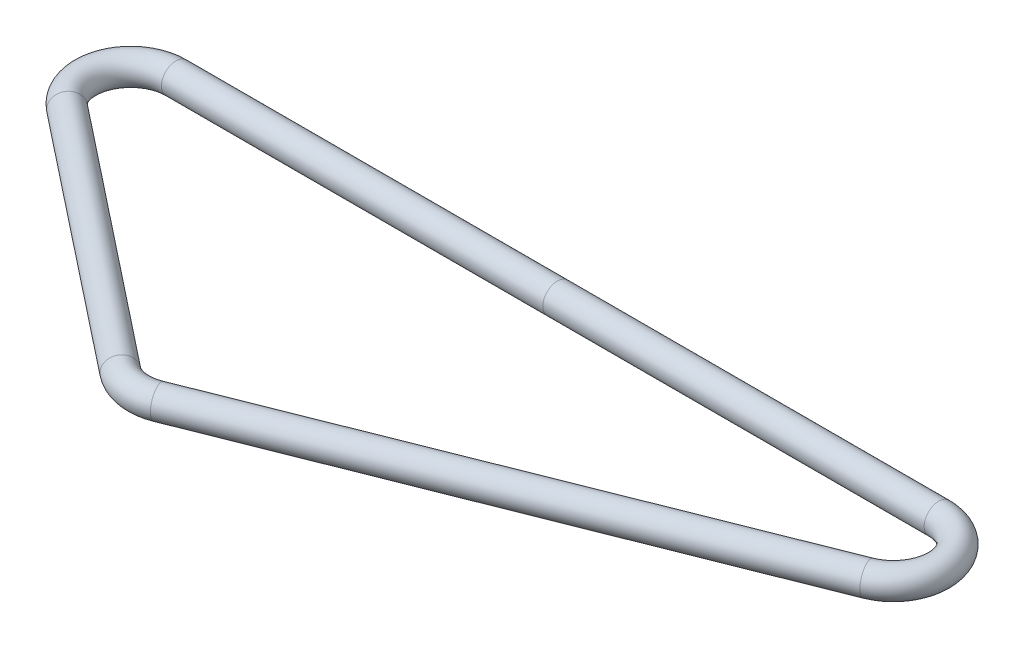
ISO-10303-21;
HEADER;
FILE_DESCRIPTION(('STEP AP214'),'2;1');
FILE_NAME('part.step','',(''),(''),'','','');
FILE_SCHEMA(('AUTOMOTIVE_DESIGN { 1 0 10303 214 1 1 1 1 }'));
ENDSEC;
DATA;
#1=APPLICATION_CONTEXT('core data for automotive mechanical design processes');
#2=APPLICATION_PROTOCOL_DEFINITION('international standard','automotive_design',2000,#1);
#3=PRODUCT_CONTEXT('',#1,'mechanical');
#4=PRODUCT('Part','Part','',(#3));
#5=PRODUCT_RELATED_PRODUCT_CATEGORY('part','',(#4));
#6=PRODUCT_DEFINITION_FORMATION('','',#4);
#7=PRODUCT_DEFINITION_CONTEXT('part definition',#1,'design');
#8=PRODUCT_DEFINITION('design','',#6,#7);
#9=PRODUCT_DEFINITION_SHAPE('','',#8);
#10=(LENGTH_UNIT() NAMED_UNIT(*) SI_UNIT(.MILLI.,.METRE.));
#11=(NAMED_UNIT(*) PLANE_ANGLE_UNIT() SI_UNIT($,.RADIAN.));
#12=(NAMED_UNIT(*) SI_UNIT($,.STERADIAN.) SOLID_ANGLE_UNIT());
#13=UNCERTAINTY_MEASURE_WITH_UNIT(LENGTH_MEASURE(1.E-05),#10,'distance_accuracy_value','');
#14=(GEOMETRIC_REPRESENTATION_CONTEXT(3) GLOBAL_UNCERTAINTY_ASSIGNED_CONTEXT((#13)) GLOBAL_UNIT_ASSIGNED_CONTEXT((#10,
#11,#12)) REPRESENTATION_CONTEXT('',''));
#15=CARTESIAN_POINT('',(0.,0.,0.));
#16=DIRECTION('',(0.,0.,1.));
#17=DIRECTION('',(1.,0.,0.));
#18=AXIS2_PLACEMENT_3D('',#15,#16,#17);
#19=CARTESIAN_POINT('',(-57.6174447189623,0.,1.99276359302836E-13));
#20=DIRECTION('',(1.,0.,0.));
#21=DIRECTION('',(0.,0.,-1.));
#22=AXIS2_PLACEMENT_3D('',#19,#20,#21);
#23=CYLINDRICAL_SURFACE('',#22,2.20345);
#24=CARTESIAN_POINT('',(0.,0.,0.));
#25=DIRECTION('',(1.,0.,0.));
#26=DIRECTION('',(0.,0.,-1.));
#27=AXIS2_PLACEMENT_3D('',#24,#25,#26);
#28=CIRCLE('',#27,2.20345);
#29=CARTESIAN_POINT('',(0.,0.,-2.20345));
#30=VERTEX_POINT('',#29);
#31=EDGE_CURVE('E57',#30,#30,#28,.T.);
#32=ORIENTED_EDGE('',*,*,#31,.F.);
#33=EDGE_LOOP('',(#32));
#34=FACE_BOUND('',#33,.T.);
#35=CARTESIAN_POINT('',(-57.6174447189623,0.,3.44283952949799E-13));
#36=DIRECTION('',(1.,0.,0.));
#37=DIRECTION('',(0.,0.,-1.));
#38=AXIS2_PLACEMENT_3D('',#35,#36,#37);
#39=CIRCLE('',#38,2.20345);
#40=CARTESIAN_POINT('',(-57.6174447189623,0.,-2.20344999999965));
#41=VERTEX_POINT('',#40);
#42=EDGE_CURVE('E10',#41,#41,#39,.T.);
#43=ORIENTED_EDGE('',*,*,#42,.T.);
#44=EDGE_LOOP('',(#43));
#45=FACE_BOUND('',#44,.T.);
#46=ADVANCED_FACE('F32',(#34,#45),#23,.T.);
#47=CARTESIAN_POINT('',(-57.6174447189623,0.,6.84418098503581));
#48=DIRECTION('',(0.,-1.,0.));
#49=DIRECTION('',(0.,0.,-1.));
#50=AXIS2_PLACEMENT_3D('',#47,#48,#49);
#51=TOROIDAL_SURFACE('',#50,6.84418098503547,2.20345);
#52=CARTESIAN_POINT('',(-61.8634957084729,0.,12.2120357101933));
#53=DIRECTION('',(-0.784294678485898,0.,-0.620388472893156));
#54=DIRECTION('',(-0.620388472893156,0.,0.784294678485898));
#55=AXIS2_PLACEMENT_3D('',#52,#53,#54);
#56=CIRCLE('',#55,2.20345);
#57=CARTESIAN_POINT('',(-63.2304906890694,0.,13.9401898195031));
#58=VERTEX_POINT('',#57);
#59=EDGE_CURVE('E38',#58,#58,#56,.T.);
#60=CARTESIAN_POINT('',(-57.6174447189623,0.,6.84418098503581));
#61=DIRECTION('',(0.,-1.,0.));
#62=DIRECTION('',(0.,0.,-1.));
#63=AXIS2_PLACEMENT_3D('',#60,#61,#62);
#64=CIRCLE('',#63,9.04763098503547);
#65=EDGE_CURVE('',#58,#41,#64,.T.);
#66=ORIENTED_EDGE('',*,*,#59,.T.);
#67=ORIENTED_EDGE('',*,*,#42,.F.);
#68=ORIENTED_EDGE('',*,*,#65,.T.);
#69=ORIENTED_EDGE('',*,*,#65,.F.);
#70=EDGE_LOOP('',(#66,#68,#67,#69));
#71=FACE_BOUND('',#70,.T.);
#72=ADVANCED_FACE('F64',(#71),#51,.T.);
#73=CARTESIAN_POINT('',(-23.3521873975323,0.,42.6750394861029));
#74=DIRECTION('',(-0.7842946784859,0.,-0.620388472893153));
#75=DIRECTION('',(-0.620388472893153,0.,0.7842946784859));
#76=AXIS2_PLACEMENT_3D('',#73,#74,#75);
#77=CYLINDRICAL_SURFACE('',#76,2.20345);
#78=ORIENTED_EDGE('',*,*,#59,.F.);
#79=EDGE_LOOP('',(#78));
#80=FACE_BOUND('',#79,.T.);
#81=CARTESIAN_POINT('',(-23.3521873975323,0.,42.6750394861028));
#82=DIRECTION('',(-0.784294678485873,0.,-0.620388472893187));
#83=DIRECTION('',(-0.620388472893187,0.,0.784294678485873));
#84=AXIS2_PLACEMENT_3D('',#81,#82,#83);
#85=CIRCLE('',#84,2.20345);
#86=CARTESIAN_POINT('',(-24.7191823781288,0.,44.4031935954125));
#87=VERTEX_POINT('',#86);
#88=EDGE_CURVE('E42',#87,#87,#85,.T.);
#89=ORIENTED_EDGE('',*,*,#88,.T.);
#90=EDGE_LOOP('',(#89));
#91=FACE_BOUND('',#90,.T.);
#92=ADVANCED_FACE('F68',(#80,#91),#77,.T.);
#93=CARTESIAN_POINT('',(-19.1061364080217,0.,37.3071847609454));
#94=DIRECTION('',(0.,-1.,0.));
#95=DIRECTION('',(0.,0.,-1.));
#96=AXIS2_PLACEMENT_3D('',#93,#94,#95);
#97=TOROIDAL_SURFACE('',#96,6.84418098503536,2.20345);
#98=CARTESIAN_POINT('',(-16.580463346966,0.,43.6683001462042));
#99=DIRECTION('',(-0.929419516983455,0.,0.369024879175159));
#100=DIRECTION('',(0.369024879175159,0.,0.929419516983455));
#101=AXIS2_PLACEMENT_3D('',#98,#99,#100);
#102=CIRCLE('',#101,2.20345);
#103=CARTESIAN_POINT('',(-15.7673354769475,0.,45.7162295809014));
#104=VERTEX_POINT('',#103);
#105=EDGE_CURVE('E46',#104,#104,#102,.T.);
#106=CARTESIAN_POINT('',(-19.1061364080217,0.,37.3071847609454));
#107=DIRECTION('',(0.,-1.,0.));
#108=DIRECTION('',(0.,0.,-1.));
#109=AXIS2_PLACEMENT_3D('',#106,#107,#108);
#110=CIRCLE('',#109,9.04763098503536);
#111=EDGE_CURVE('',#104,#87,#110,.T.);
#112=ORIENTED_EDGE('',*,*,#105,.T.);
#113=ORIENTED_EDGE('',*,*,#88,.F.);
#114=ORIENTED_EDGE('',*,*,#111,.T.);
#115=ORIENTED_EDGE('',*,*,#111,.F.);
#116=EDGE_LOOP('',(#112,#114,#113,#115));
#117=FACE_BOUND('',#116,.T.);
#118=ADVANCED_FACE('F73',(#117),#97,.T.);
#119=CARTESIAN_POINT('',(60.1431177800181,0.,13.2052963702945));
#120=DIRECTION('',(-0.929419516983454,0.,0.369024879175163));
#121=DIRECTION('',(0.369024879175163,0.,0.929419516983454));
#122=AXIS2_PLACEMENT_3D('',#119,#120,#121);
#123=CYLINDRICAL_SURFACE('',#122,2.20345);
#124=ORIENTED_EDGE('',*,*,#105,.F.);
#125=EDGE_LOOP('',(#124));
#126=FACE_BOUND('',#125,.T.);
#127=CARTESIAN_POINT('',(60.1431177800181,0.,13.2052963702945));
#128=DIRECTION('',(-0.929419516983456,0.,0.369024879175157));
#129=DIRECTION('',(0.369024879175157,0.,0.929419516983456));
#130=AXIS2_PLACEMENT_3D('',#127,#128,#129);
#131=CIRCLE('',#130,2.20345);
#132=CARTESIAN_POINT('',(60.9562456500366,0.,15.2532258049917));
#133=VERTEX_POINT('',#132);
#134=EDGE_CURVE('E51',#133,#133,#131,.T.);
#135=ORIENTED_EDGE('',*,*,#134,.T.);
#136=EDGE_LOOP('',(#135));
#137=FACE_BOUND('',#136,.T.);
#138=ADVANCED_FACE('F79',(#126,#137),#123,.T.);
#139=CARTESIAN_POINT('',(57.6174447189623,0.,6.8441809850354));
#140=DIRECTION('',(0.,-1.,0.));
#141=DIRECTION('',(0.,0.,-1.));
#142=AXIS2_PLACEMENT_3D('',#139,#140,#141);
#143=TOROIDAL_SURFACE('',#142,6.84418098503559,2.20345);
#144=CARTESIAN_POINT('',(57.6174447189623,0.,-1.99276359302836E-13));
#145=DIRECTION('',(1.,0.,0.));
#146=DIRECTION('',(0.,0.,-1.));
#147=AXIS2_PLACEMENT_3D('',#144,#145,#146);
#148=CIRCLE('',#147,2.20345);
#149=CARTESIAN_POINT('',(57.6174447189622,0.,-2.20345000000019));
#150=VERTEX_POINT('',#149);
#151=EDGE_CURVE('E54',#150,#150,#148,.T.);
#152=CARTESIAN_POINT('',(57.6174447189623,0.,6.8441809850354));
#153=DIRECTION('',(0.,-1.,0.));
#154=DIRECTION('',(0.,0.,-1.));
#155=AXIS2_PLACEMENT_3D('',#152,#153,#154);
#156=CIRCLE('',#155,9.04763098503559);
#157=EDGE_CURVE('',#150,#133,#156,.T.);
#158=ORIENTED_EDGE('',*,*,#151,.T.);
#159=ORIENTED_EDGE('',*,*,#134,.F.);
#160=ORIENTED_EDGE('',*,*,#157,.T.);
#161=ORIENTED_EDGE('',*,*,#157,.F.);
#162=EDGE_LOOP('',(#158,#160,#159,#161));
#163=FACE_BOUND('',#162,.T.);
#164=ADVANCED_FACE('F83',(#163),#143,.T.);
#165=CARTESIAN_POINT('',(0.,0.,0.));
#166=DIRECTION('',(1.,0.,0.));
#167=DIRECTION('',(0.,0.,-1.));
#168=AXIS2_PLACEMENT_3D('',#165,#166,#167);
#169=CYLINDRICAL_SURFACE('',#168,2.20345);
#170=CARTESIAN_POINT('',(57.6174447189623,0.,-2.2034500000002));
#171=CARTESIAN_POINT('',(57.0172630031397,0.,-2.2034500000002));
#172=CARTESIAN_POINT('',(56.4170812873172,0.,-2.20345000000019));
#173=CARTESIAN_POINT('',(55.2167178556722,0.,-2.20345000000019));
#174=CARTESIAN_POINT('',(54.6165361398497,0.,-2.20345000000019));
#175=CARTESIAN_POINT('',(53.4161727082046,0.,-2.20345000000018));
#176=CARTESIAN_POINT('',(52.8159909923821,0.,-2.20345000000018));
#177=CARTESIAN_POINT('',(51.615627560737,0.,-2.20345000000018));
#178=CARTESIAN_POINT('',(51.0154458449145,0.,-2.20345000000018));
#179=CARTESIAN_POINT('',(49.8150824132695,0.,-2.20345000000017));
#180=CARTESIAN_POINT('',(49.2149006974469,0.,-2.20345000000017));
#181=CARTESIAN_POINT('',(48.0145372658019,0.,-2.20345000000017));
#182=CARTESIAN_POINT('',(47.4143555499794,0.,-2.20345000000016));
#183=CARTESIAN_POINT('',(46.2139921183343,0.,-2.20345000000016));
#184=CARTESIAN_POINT('',(45.6138104025118,0.,-2.20345000000016));
#185=CARTESIAN_POINT('',(44.4134469708668,0.,-2.20345000000015));
#186=CARTESIAN_POINT('',(43.8132652550442,0.,-2.20345000000015));
#187=CARTESIAN_POINT('',(42.6129018233992,0.,-2.20345000000015));
#188=CARTESIAN_POINT('',(42.0127201075767,0.,-2.20345000000014));
#189=CARTESIAN_POINT('',(40.8123566759316,0.,-2.20345000000014));
#190=CARTESIAN_POINT('',(40.2121749601091,0.,-2.20345000000014));
#191=CARTESIAN_POINT('',(39.011811528464,0.,-2.20345000000013));
#192=CARTESIAN_POINT('',(38.4116298126415,0.,-2.20345000000013));
#193=CARTESIAN_POINT('',(37.2112663809965,0.,-2.20345000000013));
#194=CARTESIAN_POINT('',(36.6110846651739,0.,-2.20345000000013));
#195=CARTESIAN_POINT('',(35.4107212335289,0.,-2.20345000000012));
#196=CARTESIAN_POINT('',(34.8105395177064,0.,-2.20345000000012));
#197=CARTESIAN_POINT('',(33.6101760860613,0.,-2.20345000000012));
#198=CARTESIAN_POINT('',(33.0099943702388,0.,-2.20345000000011));
#199=CARTESIAN_POINT('',(31.8096309385937,0.,-2.20345000000011));
#200=CARTESIAN_POINT('',(31.2094492227712,0.,-2.20345000000011));
#201=CARTESIAN_POINT('',(30.0090857911262,0.,-2.2034500000001));
#202=CARTESIAN_POINT('',(29.4089040753037,0.,-2.2034500000001));
#203=CARTESIAN_POINT('',(28.2085406436586,0.,-2.2034500000001));
#204=CARTESIAN_POINT('',(27.6083589278361,0.,-2.2034500000001));
#205=CARTESIAN_POINT('',(26.407995496191,0.,-2.20345000000009));
#206=CARTESIAN_POINT('',(25.8078137803685,0.,-2.20345000000009));
#207=CARTESIAN_POINT('',(24.6074503487235,0.,-2.20345000000008));
#208=CARTESIAN_POINT('',(24.0072686329009,0.,-2.20345000000008));
#209=CARTESIAN_POINT('',(22.8069052012559,0.,-2.20345000000008));
#210=CARTESIAN_POINT('',(22.2067234854334,0.,-2.20345000000008));
#211=CARTESIAN_POINT('',(21.0063600537883,0.,-2.20345000000007));
#212=CARTESIAN_POINT('',(20.4061783379658,0.,-2.20345000000007));
#213=CARTESIAN_POINT('',(19.2058149063208,0.,-2.20345000000007));
#214=CARTESIAN_POINT('',(18.6056331904982,0.,-2.20345000000006));
#215=CARTESIAN_POINT('',(17.4052697588532,0.,-2.20345000000006));
#216=CARTESIAN_POINT('',(16.8050880430307,0.,-2.20345000000006));
#217=CARTESIAN_POINT('',(15.6047246113856,0.,-2.20345000000005));
#218=CARTESIAN_POINT('',(15.0045428955631,0.,-2.20345000000005));
#219=CARTESIAN_POINT('',(13.804179463918,0.,-2.20345000000005));
#220=CARTESIAN_POINT('',(13.2039977480955,0.,-2.20345000000005));
#221=CARTESIAN_POINT('',(12.0036343164505,0.,-2.20345000000004));
#222=CARTESIAN_POINT('',(11.403452600628,0.,-2.20345000000004));
#223=CARTESIAN_POINT('',(10.2030891689829,0.,-2.20345000000003));
#224=CARTESIAN_POINT('',(9.60290745316038,0.,-2.20345000000003));
#225=CARTESIAN_POINT('',(8.40254402151533,0.,-2.20345000000003));
#226=CARTESIAN_POINT('',(7.80236230569281,0.,-2.20345000000003));
#227=CARTESIAN_POINT('',(6.60199887404776,0.,-2.20345000000002));
#228=CARTESIAN_POINT('',(6.00181715822524,0.,-2.20345000000002));
#229=CARTESIAN_POINT('',(4.80145372658019,0.,-2.20345000000002));
#230=CARTESIAN_POINT('',(4.20127201075766,0.,-2.20345000000001));
#231=CARTESIAN_POINT('',(3.00090857911262,0.,-2.20345000000001));
#232=CARTESIAN_POINT('',(2.40072686329009,0.,-2.20345000000001));
#233=CARTESIAN_POINT('',(1.20036343164505,0.,-2.20345));
#234=CARTESIAN_POINT('',(0.600181715822525,0.,-2.20345));
#235=CARTESIAN_POINT('',(0.,0.,-2.20345));
#236=B_SPLINE_CURVE_WITH_KNOTS('',3,(#170,#171,#172,#173,#174,#175,#176,#177,#178,#179,#180,
#181,#182,#183,#184,#185,#186,#187,#188,#189,#190,#191,#192,#193,#194,#195,#196,#197,#198,#199,
#200,#201,#202,#203,#204,#205,#206,#207,#208,#209,#210,#211,#212,#213,#214,#215,#216,#217,#218,
#219,#220,#221,#222,#223,#224,#225,#226,#227,#228,#229,#230,#231,#232,#233,#234,#235),
.UNSPECIFIED.,.F.,.F.,(4,2,2,2,2,2,2,2,2,2,2,2,2,2,2,2,2,2,2,2,2,2,2,2,2,2,2,2,2,2,2,2,4),(0.,
1.80054514746757,3.60109029493514,5.40163544240271,7.20218058987029,9.00272573733785,
10.8032708848054,12.603816032273,14.4043611797406,16.2049063272081,18.0054514746757,
19.8059966221433,21.6065417696109,23.4070869170784,25.207632064546,27.0081772120136,
28.8087223594811,30.6092675069487,32.4098126544163,34.2103578018838,36.0109029493514,
37.811448096819,39.6119932442866,41.4125383917541,43.2130835392217,45.0136286866893,
46.8141738341568,48.6147189816244,50.415264129092,52.2158092765596,54.0163544240271,
55.8168995714947,57.6174447189623),.UNSPECIFIED.);
#237=EDGE_CURVE('BSEAM61',#150,#30,#236,.T.);
#238=ORIENTED_EDGE('',*,*,#151,.F.);
#239=ORIENTED_EDGE('',*,*,#31,.T.);
#240=ORIENTED_EDGE('',*,*,#237,.T.);
#241=ORIENTED_EDGE('',*,*,#237,.F.);
#242=EDGE_LOOP('',(#238,#240,#239,#241));
#243=FACE_BOUND('',#242,.T.);
#244=ADVANCED_FACE('F61',(#243),#169,.T.);
#245=CLOSED_SHELL('',(#46,#72,#92,#118,#138,#164,#244));
#246=MANIFOLD_SOLID_BREP('B2',#245);
#247=ADVANCED_BREP_SHAPE_REPRESENTATION('',(#18,#246),#14);
#248=SHAPE_DEFINITION_REPRESENTATION(#9,#247);
ENDSEC;
END-ISO-10303-21;
